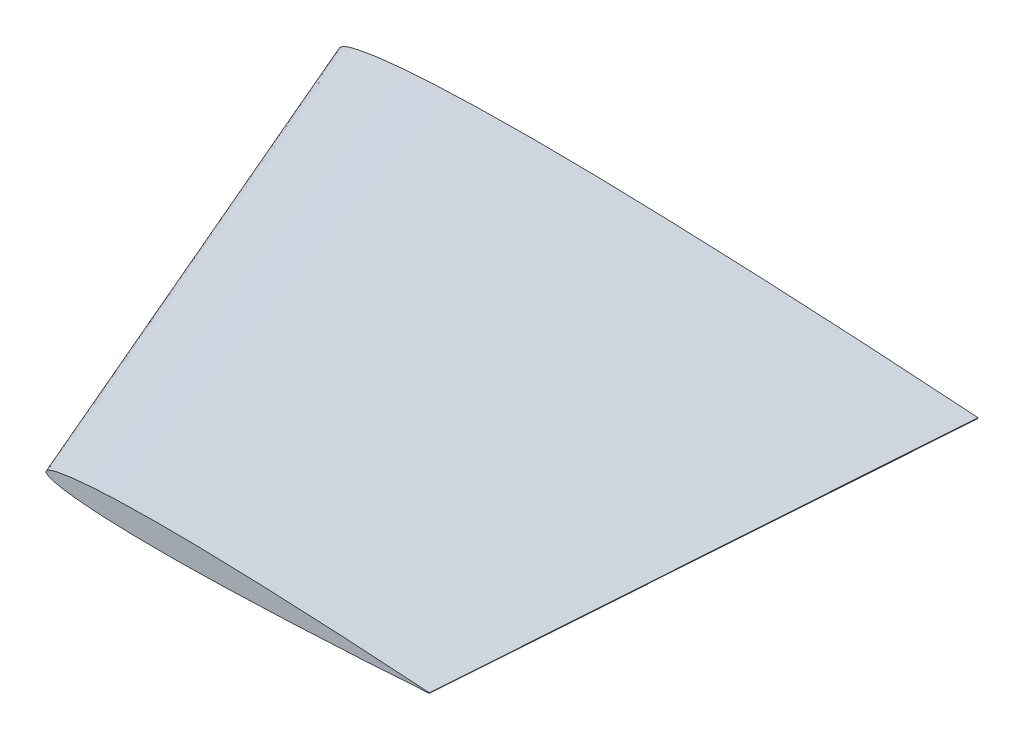
ISO-10303-21;
HEADER;
FILE_DESCRIPTION(('STEP AP214'),'2;1');
FILE_NAME('part.step','',(''),(''),'','','');
FILE_SCHEMA(('AUTOMOTIVE_DESIGN { 1 0 10303 214 1 1 1 1 }'));
ENDSEC;
DATA;
#1=APPLICATION_CONTEXT('core data for automotive mechanical design processes');
#2=APPLICATION_PROTOCOL_DEFINITION('international standard','automotive_design',2000,#1);
#3=PRODUCT_CONTEXT('',#1,'mechanical');
#4=PRODUCT('Part','Part','',(#3));
#5=PRODUCT_RELATED_PRODUCT_CATEGORY('part','',(#4));
#6=PRODUCT_DEFINITION_FORMATION('','',#4);
#7=PRODUCT_DEFINITION_CONTEXT('part definition',#1,'design');
#8=PRODUCT_DEFINITION('design','',#6,#7);
#9=PRODUCT_DEFINITION_SHAPE('','',#8);
#10=(LENGTH_UNIT() NAMED_UNIT(*) SI_UNIT(.MILLI.,.METRE.));
#11=(NAMED_UNIT(*) PLANE_ANGLE_UNIT() SI_UNIT($,.RADIAN.));
#12=(NAMED_UNIT(*) SI_UNIT($,.STERADIAN.) SOLID_ANGLE_UNIT());
#13=UNCERTAINTY_MEASURE_WITH_UNIT(LENGTH_MEASURE(1.E-05),#10,'distance_accuracy_value','');
#14=(GEOMETRIC_REPRESENTATION_CONTEXT(3) GLOBAL_UNCERTAINTY_ASSIGNED_CONTEXT((#13)) GLOBAL_UNIT_ASSIGNED_CONTEXT((#10,
#11,#12)) REPRESENTATION_CONTEXT('',''));
#15=CARTESIAN_POINT('',(0.,0.,0.));
#16=DIRECTION('',(0.,0.,1.));
#17=DIRECTION('',(1.,0.,0.));
#18=AXIS2_PLACEMENT_3D('',#15,#16,#17);
#19=CARTESIAN_POINT('',(61.3427237748503,0.167789039990991,-39.8333180061629));
#20=CARTESIAN_POINT('',(54.327020304412,-0.0916953763410755,56.1666819938371));
#21=CARTESIAN_POINT('',(41.3621776346398,1.54257078959004,-39.8333180061629));
#22=CARTESIAN_POINT('',(42.3386949993695,0.733173509735517,56.1666819938371));
#23=CARTESIAN_POINT('',(9.37571445342743,3.31686530920903,-39.8333180061629));
#24=CARTESIAN_POINT('',(23.1468208992702,1.79775001026154,56.1666819938371));
#25=CARTESIAN_POINT('',(-27.6785678236952,3.98854825711008,-39.8333180061629));
#26=CARTESIAN_POINT('',(0.914255945049032,2.20075969904787,56.1666819938371));
#27=CARTESIAN_POINT('',(-45.729654241406,3.10233902574017,-39.8333180061629));
#28=CARTESIAN_POINT('',(-9.91639375623573,1.66903426575801,56.1666819938371));
#29=CARTESIAN_POINT('',(-52.6478799681574,2.26180997587928,-39.8333180061629));
#30=CARTESIAN_POINT('',(-14.0673283685342,1.16471693592752,56.1666819938371));
#31=CARTESIAN_POINT('',(-55.2448650060371,1.76324514808242,-39.8333180061629));
#32=CARTESIAN_POINT('',(-15.6255190820394,0.865578098615107,56.1666819938371));
#33=CARTESIAN_POINT('',(-57.1486338328694,1.32224532251204,-39.8333180061629));
#34=CARTESIAN_POINT('',(-16.7677801514574,0.600978255783896,56.1666819938371));
#35=CARTESIAN_POINT('',(-59.4819048273779,0.0921890399909906,-39.8333180061629));
#36=CARTESIAN_POINT('',(-18.1677424703408,-0.13705536726453,56.1666819938371));
#37=CARTESIAN_POINT('',(-57.1486338328694,-1.13786724253005,-39.8333180061629));
#38=CARTESIAN_POINT('',(-16.7677801514589,-0.875088990315845,56.1666819938371));
#39=CARTESIAN_POINT('',(-55.244865006037,-1.57886706810044,-39.8333180061629));
#40=CARTESIAN_POINT('',(-15.6255190820414,-1.13968883314942,56.1666819938371));
#41=CARTESIAN_POINT('',(-52.6478799681574,-2.07743189589729,-39.8333180061629));
#42=CARTESIAN_POINT('',(-14.0673283685369,-1.43882767046504,56.1666819938371));
#43=CARTESIAN_POINT('',(-45.7296542414059,-2.91796094575821,-39.8333180061629));
#44=CARTESIAN_POINT('',(-9.91639375623939,-1.94314500030412,56.1666819938371));
#45=CARTESIAN_POINT('',(-27.6785678236952,-3.80417017712811,-39.8333180061629));
#46=CARTESIAN_POINT('',(0.914255945044283,-2.47487043361634,56.1666819938371));
#47=CARTESIAN_POINT('',(9.37571445342756,-3.13248722922705,-39.8333180061629));
#48=CARTESIAN_POINT('',(23.1468208992663,-2.07186074487593,56.1666819938371));
#49=CARTESIAN_POINT('',(41.3621776346395,-1.35819270960806,-39.8333180061629));
#50=CARTESIAN_POINT('',(42.3386949993674,-1.00728424438953,56.1666819938371));
#51=CARTESIAN_POINT('',(61.3427237748503,0.0165890399909909,-39.8333180061629));
#52=CARTESIAN_POINT('',(54.327020304412,-0.182415358337697,56.1666819938371));
#53=B_SPLINE_SURFACE_WITH_KNOTS('',3,1,((#19,#20),(#21,#22),(#23,#24),(#25,#26),(#27,#28),(#29,
#30),(#31,#32),(#33,#34),(#35,#36),(#37,#38),(#39,#40),(#41,#42),(#43,#44),(#45,#46),(#47,#48),
(#49,#50),(#51,#52)),.UNSPECIFIED.,.F.,.F.,.F.,(4,1,1,1,1,1,1,1,1,1,1,1,1,1,4),(2,2),(0.,
0.249016479528594,0.398243492902326,0.46054281715137,0.473079727808674,0.485731111482558,
0.492200581361296,0.5,0.507799418638704,0.514268888517442,0.526920272191326,0.53945718284863,
0.601756507097674,0.750983520471406,1.),(0.,1.),.UNSPECIFIED.);
#54=CARTESIAN_POINT('',(61.3427237748503,0.167789039990991,-39.8333180061629));
#55=CARTESIAN_POINT('',(41.3621776346398,1.54257078959004,-39.8333180061629));
#56=CARTESIAN_POINT('',(9.37571445342743,3.31686530920903,-39.8333180061629));
#57=CARTESIAN_POINT('',(-27.6785678236952,3.98854825711008,-39.8333180061629));
#58=CARTESIAN_POINT('',(-45.729654241406,3.10233902574017,-39.8333180061629));
#59=CARTESIAN_POINT('',(-52.6478799681574,2.26180997587928,-39.8333180061629));
#60=CARTESIAN_POINT('',(-55.2448650060371,1.76324514808242,-39.8333180061629));
#61=CARTESIAN_POINT('',(-57.1486338328694,1.32224532251204,-39.8333180061629));
#62=CARTESIAN_POINT('',(-59.4819048273779,0.0921890399909906,-39.8333180061629));
#63=CARTESIAN_POINT('',(-57.1486338328694,-1.13786724253005,-39.8333180061629));
#64=CARTESIAN_POINT('',(-55.244865006037,-1.57886706810044,-39.8333180061629));
#65=CARTESIAN_POINT('',(-52.6478799681574,-2.07743189589729,-39.8333180061629));
#66=CARTESIAN_POINT('',(-45.7296542414059,-2.91796094575821,-39.8333180061629));
#67=CARTESIAN_POINT('',(-27.6785678236952,-3.80417017712811,-39.8333180061629));
#68=CARTESIAN_POINT('',(9.37571445342756,-3.13248722922705,-39.8333180061629));
#69=CARTESIAN_POINT('',(41.3621776346395,-1.35819270960806,-39.8333180061629));
#70=CARTESIAN_POINT('',(61.3427237748503,0.0165890399909909,-39.8333180061629));
#71=B_SPLINE_CURVE_WITH_KNOTS('',3,(#54,#55,#56,#57,#58,#59,#60,#61,#62,#63,#64,#65,#66,#67,#68,
#69,#70),.UNSPECIFIED.,.F.,.F.,(4,1,1,1,1,1,1,1,1,1,1,1,1,1,4),(0.,0.249016479528594,
0.398243492902326,0.46054281715137,0.473079727808674,0.485731111482558,0.492200581361296,0.5,
0.507799418638704,0.514268888517442,0.526920272191326,0.53945718284863,0.601756507097674,
0.750983520471406,1.),.UNSPECIFIED.);
#72=CARTESIAN_POINT('',(61.3427237748503,0.167789039990991,-39.8333180061629));
#73=VERTEX_POINT('',#72);
#74=CARTESIAN_POINT('',(61.3427237748503,0.0165890399909909,-39.8333180061629));
#75=VERTEX_POINT('',#74);
#76=EDGE_CURVE('E12',#73,#75,#71,.T.);
#77=DIRECTION('',(-0.0728857162961295,-0.00206744458048773,0.99733815631054));
#78=VECTOR('',#77,1.);
#79=CARTESIAN_POINT('',(57.8348720396312,-0.0829131591733532,8.16668199383709));
#80=LINE('',#79,#78);
#81=CARTESIAN_POINT('',(54.327020304412,-0.182415358337697,56.1666819938371));
#82=VERTEX_POINT('',#81);
#83=EDGE_CURVE('E91',#75,#82,#80,.T.);
#84=CARTESIAN_POINT('',(54.327020304412,-0.0916953763410755,56.1666819938371));
#85=CARTESIAN_POINT('',(42.3386949993695,0.733173509735517,56.1666819938371));
#86=CARTESIAN_POINT('',(23.1468208992702,1.79775001026154,56.1666819938371));
#87=CARTESIAN_POINT('',(0.914255945049032,2.20075969904787,56.1666819938371));
#88=CARTESIAN_POINT('',(-9.91639375623573,1.66903426575801,56.1666819938371));
#89=CARTESIAN_POINT('',(-14.0673283685342,1.16471693592752,56.1666819938371));
#90=CARTESIAN_POINT('',(-15.6255190820394,0.865578098615107,56.1666819938371));
#91=CARTESIAN_POINT('',(-16.7677801514574,0.600978255783896,56.1666819938371));
#92=CARTESIAN_POINT('',(-18.1677424703408,-0.13705536726453,56.1666819938371));
#93=CARTESIAN_POINT('',(-16.7677801514589,-0.875088990315845,56.1666819938371));
#94=CARTESIAN_POINT('',(-15.6255190820414,-1.13968883314942,56.1666819938371));
#95=CARTESIAN_POINT('',(-14.0673283685369,-1.43882767046504,56.1666819938371));
#96=CARTESIAN_POINT('',(-9.91639375623939,-1.94314500030412,56.1666819938371));
#97=CARTESIAN_POINT('',(0.914255945044283,-2.47487043361634,56.1666819938371));
#98=CARTESIAN_POINT('',(23.1468208992663,-2.07186074487593,56.1666819938371));
#99=CARTESIAN_POINT('',(42.3386949993674,-1.00728424438953,56.1666819938371));
#100=CARTESIAN_POINT('',(54.327020304412,-0.182415358337697,56.1666819938371));
#101=B_SPLINE_CURVE_WITH_KNOTS('',3,(#84,#85,#86,#87,#88,#89,#90,#91,#92,#93,#94,#95,#96,#97,
#98,#99,#100),.UNSPECIFIED.,.F.,.F.,(4,1,1,1,1,1,1,1,1,1,1,1,1,1,4),(0.,0.249016479528594,
0.398243492902326,0.46054281715137,0.473079727808674,0.485731111482558,0.492200581361296,0.5,
0.507799418638704,0.514268888517442,0.526920272191326,0.53945718284863,0.601756507097674,
0.750983520471406,1.),.UNSPECIFIED.);
#102=CARTESIAN_POINT('',(54.327020304412,-0.0916953763410755,56.1666819938371));
#103=VERTEX_POINT('',#102);
#104=EDGE_CURVE('E117',#103,#82,#101,.T.);
#105=DIRECTION('',(-0.0728856072288412,-0.00269576377201165,0.997336663878637));
#106=VECTOR('',#105,1.);
#107=CARTESIAN_POINT('',(57.8348720396312,0.0380468318249577,8.16668199383709));
#108=LINE('',#107,#106);
#109=EDGE_CURVE('E111',#73,#103,#108,.T.);
#110=ORIENTED_EDGE('',*,*,#76,.T.);
#111=ORIENTED_EDGE('',*,*,#83,.T.);
#112=ORIENTED_EDGE('',*,*,#104,.F.);
#113=ORIENTED_EDGE('',*,*,#109,.F.);
#114=EDGE_LOOP('',(#110,#111,#112,#113));
#115=FACE_BOUND('',#114,.T.);
#116=ADVANCED_FACE('F80',(#115),#53,.T.);
#117=CARTESIAN_POINT('',(61.3427237748503,0.0165890399909909,-39.8333180061629));
#118=DIRECTION('',(0.997340287792124,0.,0.0728858720653248));
#119=DIRECTION('',(0.,1.,0.));
#120=AXIS2_PLACEMENT_3D('',#117,#118,#119);
#121=PLANE('',#120);
#122=DIRECTION('',(0.,1.,0.));
#123=VECTOR('',#122,1.);
#124=CARTESIAN_POINT('',(61.3427237748503,0.0921890399909909,-39.8333180061629));
#125=LINE('',#124,#123);
#126=EDGE_CURVE('E98',#75,#73,#125,.T.);
#127=ORIENTED_EDGE('',*,*,#126,.T.);
#128=ORIENTED_EDGE('',*,*,#109,.T.);
#129=DIRECTION('',(0.,1.,0.));
#130=VECTOR('',#129,1.);
#131=CARTESIAN_POINT('',(54.327020304412,-0.137055367339386,56.1666819938371));
#132=LINE('',#131,#130);
#133=EDGE_CURVE('E84',#82,#103,#132,.T.);
#134=ORIENTED_EDGE('',*,*,#133,.F.);
#135=ORIENTED_EDGE('',*,*,#83,.F.);
#136=EDGE_LOOP('',(#127,#128,#134,#135));
#137=FACE_BOUND('',#136,.T.);
#138=ADVANCED_FACE('F82',(#137),#121,.T.);
#139=CARTESIAN_POINT('',(-58.6572762251497,0.0921890399909909,-39.8333180061629));
#140=DIRECTION('',(0.,0.,-1.));
#141=DIRECTION('',(-1.,0.,0.));
#142=AXIS2_PLACEMENT_3D('',#139,#140,#141);
#143=PLANE('',#142);
#144=ORIENTED_EDGE('',*,*,#126,.F.);
#145=ORIENTED_EDGE('',*,*,#76,.F.);
#146=EDGE_LOOP('',(#144,#145));
#147=FACE_BOUND('',#146,.T.);
#148=ADVANCED_FACE('F115',(#147),#143,.T.);
#149=CARTESIAN_POINT('',(-17.6729654071923,-0.137055367265041,56.1666819938371));
#150=DIRECTION('',(0.,0.,-1.));
#151=DIRECTION('',(-1.,0.,0.));
#152=AXIS2_PLACEMENT_3D('',#149,#150,#151);
#153=PLANE('',#152);
#154=ORIENTED_EDGE('',*,*,#104,.T.);
#155=ORIENTED_EDGE('',*,*,#133,.T.);
#156=EDGE_LOOP('',(#154,#155));
#157=FACE_BOUND('',#156,.T.);
#158=ADVANCED_FACE('F134',(#157),#153,.F.);
#159=CLOSED_SHELL('',(#116,#138,#148,#158));
#160=MANIFOLD_SOLID_BREP('B2',#159);
#161=ADVANCED_BREP_SHAPE_REPRESENTATION('',(#18,#160),#14);
#162=SHAPE_DEFINITION_REPRESENTATION(#9,#161);
ENDSEC;
END-ISO-10303-21;
